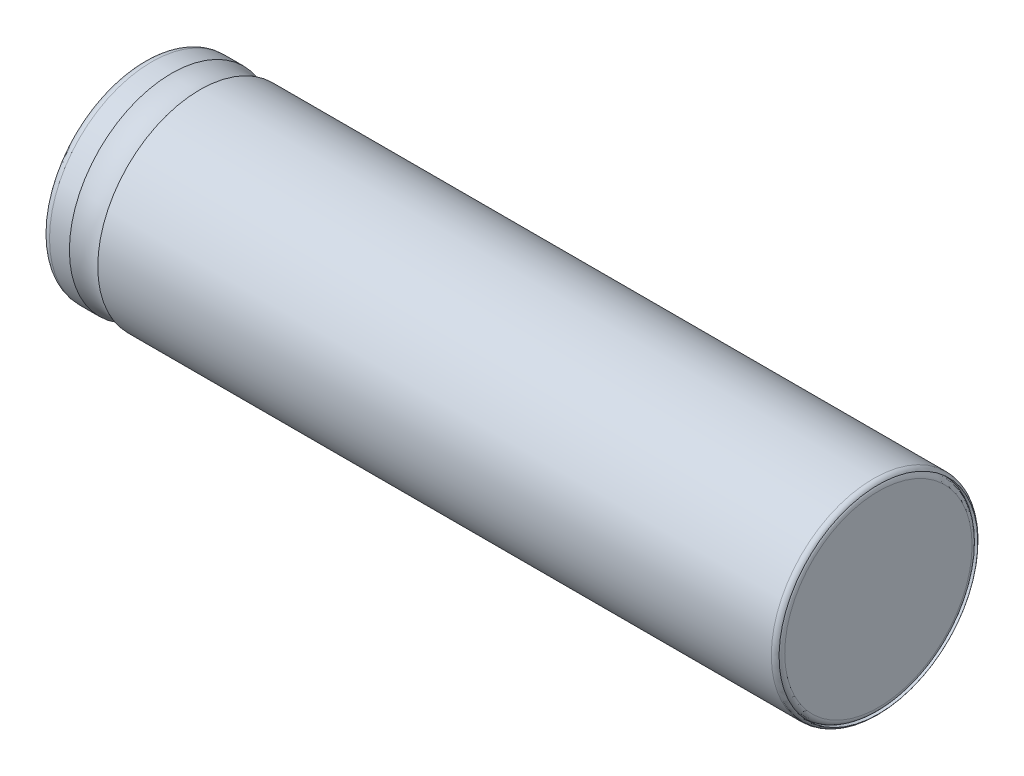
ISO-10303-21;
HEADER;
FILE_DESCRIPTION(('STEP AP214'),'2;1');
FILE_NAME('part.step','',(''),(''),'','','');
FILE_SCHEMA(('AUTOMOTIVE_DESIGN { 1 0 10303 214 1 1 1 1 }'));
ENDSEC;
DATA;
#1=APPLICATION_CONTEXT('core data for automotive mechanical design processes');
#2=APPLICATION_PROTOCOL_DEFINITION('international standard','automotive_design',2000,#1);
#3=PRODUCT_CONTEXT('',#1,'mechanical');
#4=PRODUCT('Part','Part','',(#3));
#5=PRODUCT_RELATED_PRODUCT_CATEGORY('part','',(#4));
#6=PRODUCT_DEFINITION_FORMATION('','',#4);
#7=PRODUCT_DEFINITION_CONTEXT('part definition',#1,'design');
#8=PRODUCT_DEFINITION('design','',#6,#7);
#9=PRODUCT_DEFINITION_SHAPE('','',#8);
#10=(LENGTH_UNIT() NAMED_UNIT(*) SI_UNIT(.MILLI.,.METRE.));
#11=(NAMED_UNIT(*) PLANE_ANGLE_UNIT() SI_UNIT($,.RADIAN.));
#12=(NAMED_UNIT(*) SI_UNIT($,.STERADIAN.) SOLID_ANGLE_UNIT());
#13=UNCERTAINTY_MEASURE_WITH_UNIT(LENGTH_MEASURE(1.E-05),#10,'distance_accuracy_value','');
#14=(GEOMETRIC_REPRESENTATION_CONTEXT(3) GLOBAL_UNCERTAINTY_ASSIGNED_CONTEXT((#13)) GLOBAL_UNIT_ASSIGNED_CONTEXT((#10,
#11,#12)) REPRESENTATION_CONTEXT('',''));
#15=CARTESIAN_POINT('',(0.,0.,0.));
#16=DIRECTION('',(0.,0.,1.));
#17=DIRECTION('',(1.,0.,0.));
#18=AXIS2_PLACEMENT_3D('',#15,#16,#17);
#19=CARTESIAN_POINT('',(2.099387525494,0.,0.));
#20=DIRECTION('',(1.,0.,0.));
#21=DIRECTION('',(0.,1.,0.));
#22=AXIS2_PLACEMENT_3D('',#19,#20,#21);
#23=CYLINDRICAL_SURFACE('',#22,8.75);
#24=CARTESIAN_POINT('',(3.,0.,0.));
#25=DIRECTION('',(1.,0.,0.));
#26=DIRECTION('',(0.,0.,-1.));
#27=AXIS2_PLACEMENT_3D('',#24,#25,#26);
#28=CIRCLE('',#27,8.75);
#29=CARTESIAN_POINT('',(3.,-8.75,0.));
#30=VERTEX_POINT('',#29);
#31=CARTESIAN_POINT('',(3.,0.,8.75));
#32=VERTEX_POINT('',#31);
#33=EDGE_CURVE('P0_E97',#30,#32,#28,.T.);
#34=ORIENTED_EDGE('',*,*,#33,.F.);
#35=DIRECTION('',(-1.,0.,0.));
#36=VECTOR('',#35,1.);
#37=CARTESIAN_POINT('',(2.099387525494,-8.75,0.));
#38=LINE('',#37,#36);
#39=CARTESIAN_POINT('',(1.19877505098799,-8.75,0.));
#40=VERTEX_POINT('',#39);
#41=EDGE_CURVE('P0_E11',#30,#40,#38,.T.);
#42=ORIENTED_EDGE('',*,*,#41,.T.);
#43=CARTESIAN_POINT('',(1.19877505098799,0.,0.));
#44=DIRECTION('',(1.,0.,0.));
#45=DIRECTION('',(0.,0.,-1.));
#46=AXIS2_PLACEMENT_3D('',#43,#44,#45);
#47=CIRCLE('',#46,8.75);
#48=EDGE_CURVE('P0_E27',#40,#40,#47,.T.);
#49=ORIENTED_EDGE('',*,*,#48,.T.);
#50=ORIENTED_EDGE('',*,*,#41,.F.);
#51=CARTESIAN_POINT('',(3.,0.,0.));
#52=DIRECTION('',(1.,0.,0.));
#53=DIRECTION('',(0.,0.,-1.));
#54=AXIS2_PLACEMENT_3D('',#51,#52,#53);
#55=CIRCLE('',#54,8.75);
#56=EDGE_CURVE('P0_E45',#32,#30,#55,.T.);
#57=ORIENTED_EDGE('',*,*,#56,.F.);
#58=EDGE_LOOP('',(#34,#42,#49,#50,#57));
#59=FACE_BOUND('',#58,.T.);
#60=ADVANCED_FACE('P0_F17',(#59),#23,.T.);
#61=CARTESIAN_POINT('',(1.19877505098799,8.75,0.));
#62=DIRECTION('',(-1.,0.,0.));
#63=DIRECTION('',(0.,0.,1.));
#64=AXIS2_PLACEMENT_3D('',#61,#62,#63);
#65=PLANE('',#64);
#66=ORIENTED_EDGE('',*,*,#48,.F.);
#67=EDGE_LOOP('',(#66));
#68=FACE_BOUND('',#67,.T.);
#69=ADVANCED_FACE('P0_F19',(#68),#65,.T.);
#70=CARTESIAN_POINT('',(4.25,0.,0.));
#71=DIRECTION('',(1.,0.,0.));
#72=DIRECTION('',(0.,0.,-1.));
#73=AXIS2_PLACEMENT_3D('',#70,#71,#72);
#74=TOROIDAL_SURFACE('',#73,11.7499999999994,3.24999999999946);
#75=ORIENTED_EDGE('',*,*,#33,.T.);
#76=CARTESIAN_POINT('',(4.25,0.,11.7499999999994));
#77=DIRECTION('',(0.,-1.,0.));
#78=DIRECTION('',(0.,0.,1.));
#79=AXIS2_PLACEMENT_3D('',#76,#77,#78);
#80=CIRCLE('',#79,3.24999999999946);
#81=CARTESIAN_POINT('',(5.5,0.,8.75));
#82=VERTEX_POINT('',#81);
#83=EDGE_CURVE('P0_E106',#32,#82,#80,.T.);
#84=ORIENTED_EDGE('',*,*,#83,.T.);
#85=CARTESIAN_POINT('',(5.5,0.,0.));
#86=DIRECTION('',(1.,0.,0.));
#87=DIRECTION('',(0.,0.,-1.));
#88=AXIS2_PLACEMENT_3D('',#85,#86,#87);
#89=CIRCLE('',#88,8.75);
#90=CARTESIAN_POINT('',(5.5,-8.75,0.));
#91=VERTEX_POINT('',#90);
#92=EDGE_CURVE('P0_E92',#91,#82,#89,.T.);
#93=ORIENTED_EDGE('',*,*,#92,.F.);
#94=CARTESIAN_POINT('',(5.5,0.,0.));
#95=DIRECTION('',(1.,0.,0.));
#96=DIRECTION('',(0.,0.,-1.));
#97=AXIS2_PLACEMENT_3D('',#94,#95,#96);
#98=CIRCLE('',#97,8.75);
#99=EDGE_CURVE('P0_E96',#82,#91,#98,.T.);
#100=ORIENTED_EDGE('',*,*,#99,.F.);
#101=ORIENTED_EDGE('',*,*,#83,.F.);
#102=ORIENTED_EDGE('',*,*,#56,.T.);
#103=EDGE_LOOP('',(#75,#84,#93,#100,#101,#102));
#104=FACE_BOUND('',#103,.T.);
#105=ADVANCED_FACE('P0_F111',(#104),#74,.F.);
#106=CARTESIAN_POINT('',(65.25,0.,0.));
#107=DIRECTION('',(1.,0.,0.));
#108=DIRECTION('',(0.,1.,0.));
#109=AXIS2_PLACEMENT_3D('',#106,#107,#108);
#110=PLANE('',#109);
#111=CARTESIAN_POINT('',(65.25,0.,0.));
#112=DIRECTION('',(-1.,0.,0.));
#113=DIRECTION('',(0.,-1.,0.));
#114=AXIS2_PLACEMENT_3D('',#111,#112,#113);
#115=CIRCLE('',#114,8.25);
#116=CARTESIAN_POINT('',(65.25,0.,8.25));
#117=VERTEX_POINT('',#116);
#118=EDGE_CURVE('P0_E73',#117,#117,#115,.T.);
#119=ORIENTED_EDGE('',*,*,#118,.F.);
#120=EDGE_LOOP('',(#119));
#121=FACE_BOUND('',#120,.T.);
#122=ADVANCED_FACE('P0_F126',(#121),#110,.T.);
#123=CARTESIAN_POINT('',(35.375,0.,0.));
#124=DIRECTION('',(1.,0.,0.));
#125=DIRECTION('',(0.,1.,0.));
#126=AXIS2_PLACEMENT_3D('',#123,#124,#125);
#127=CYLINDRICAL_SURFACE('',#126,8.75);
#128=CARTESIAN_POINT('',(64.75,0.,0.));
#129=DIRECTION('',(1.,0.,0.));
#130=DIRECTION('',(0.,-1.,0.));
#131=AXIS2_PLACEMENT_3D('',#128,#129,#130);
#132=CIRCLE('',#131,8.75);
#133=CARTESIAN_POINT('',(64.75,-8.75,0.));
#134=VERTEX_POINT('',#133);
#135=CARTESIAN_POINT('',(64.75,0.,8.75));
#136=VERTEX_POINT('',#135);
#137=EDGE_CURVE('P0_E76',#134,#136,#132,.T.);
#138=ORIENTED_EDGE('',*,*,#137,.F.);
#139=DIRECTION('',(-1.,0.,0.));
#140=VECTOR('',#139,1.);
#141=CARTESIAN_POINT('',(35.375,-8.75,0.));
#142=LINE('',#141,#140);
#143=EDGE_CURVE('P0_E93',#134,#91,#142,.T.);
#144=ORIENTED_EDGE('',*,*,#143,.T.);
#145=ORIENTED_EDGE('',*,*,#92,.T.);
#146=ORIENTED_EDGE('',*,*,#99,.T.);
#147=ORIENTED_EDGE('',*,*,#143,.F.);
#148=CARTESIAN_POINT('',(64.75,0.,0.));
#149=DIRECTION('',(1.,0.,0.));
#150=DIRECTION('',(0.,-1.,0.));
#151=AXIS2_PLACEMENT_3D('',#148,#149,#150);
#152=CIRCLE('',#151,8.75);
#153=EDGE_CURVE('P0_E78',#136,#134,#152,.T.);
#154=ORIENTED_EDGE('',*,*,#153,.F.);
#155=EDGE_LOOP('',(#138,#144,#145,#146,#147,#154));
#156=FACE_BOUND('',#155,.T.);
#157=ADVANCED_FACE('P0_F130',(#156),#127,.T.);
#158=CARTESIAN_POINT('',(64.75,0.,0.));
#159=DIRECTION('',(1.,0.,0.));
#160=DIRECTION('',(0.,0.,-1.));
#161=AXIS2_PLACEMENT_3D('',#158,#159,#160);
#162=TOROIDAL_SURFACE('',#161,8.25,0.5);
#163=ORIENTED_EDGE('',*,*,#118,.T.);
#164=CARTESIAN_POINT('',(64.75,0.,8.25));
#165=DIRECTION('',(0.,-1.,0.));
#166=DIRECTION('',(0.,0.,1.));
#167=AXIS2_PLACEMENT_3D('',#164,#165,#166);
#168=CIRCLE('',#167,0.5);
#169=EDGE_CURVE('P0_E69',#117,#136,#168,.T.);
#170=ORIENTED_EDGE('',*,*,#169,.T.);
#171=ORIENTED_EDGE('',*,*,#153,.T.);
#172=ORIENTED_EDGE('',*,*,#137,.T.);
#173=ORIENTED_EDGE('',*,*,#169,.F.);
#174=EDGE_LOOP('',(#163,#170,#171,#172,#173));
#175=FACE_BOUND('',#174,.T.);
#176=ADVANCED_FACE('P0_F75',(#175),#162,.T.);
#177=CLOSED_SHELL('',(#60,#69,#105,#122,#157,#176));
#178=MANIFOLD_SOLID_BREP('P0_B1',#177);
#179=CARTESIAN_POINT('',(1.19877505098799,0.,0.));
#180=DIRECTION('',(1.,0.,0.));
#181=DIRECTION('',(0.,-1.,0.));
#182=AXIS2_PLACEMENT_3D('',#179,#180,#181);
#183=PLANE('',#182);
#184=CARTESIAN_POINT('',(1.19877505098799,0.,0.));
#185=DIRECTION('',(1.,0.,0.));
#186=DIRECTION('',(0.,0.,-1.));
#187=AXIS2_PLACEMENT_3D('',#184,#185,#186);
#188=CIRCLE('',#187,4.);
#189=CARTESIAN_POINT('',(1.19877505098799,-4.,0.));
#190=VERTEX_POINT('',#189);
#191=EDGE_CURVE('P1_E25',#190,#190,#188,.T.);
#192=ORIENTED_EDGE('',*,*,#191,.T.);
#193=EDGE_LOOP('',(#192));
#194=FACE_BOUND('',#193,.T.);
#195=ADVANCED_FACE('P1_F17',(#194),#183,.T.);
#196=CARTESIAN_POINT('',(0.599387525493993,0.,0.));
#197=DIRECTION('',(1.,0.,0.));
#198=DIRECTION('',(0.,1.,0.));
#199=AXIS2_PLACEMENT_3D('',#196,#197,#198);
#200=CYLINDRICAL_SURFACE('',#199,4.);
#201=ORIENTED_EDGE('',*,*,#191,.F.);
#202=DIRECTION('',(-1.,0.,0.));
#203=VECTOR('',#202,1.);
#204=CARTESIAN_POINT('',(0.599387525493989,-4.,0.));
#205=LINE('',#204,#203);
#206=CARTESIAN_POINT('',(0.499999999999991,-4.,0.));
#207=VERTEX_POINT('',#206);
#208=EDGE_CURVE('P1_E11',#190,#207,#205,.T.);
#209=ORIENTED_EDGE('',*,*,#208,.T.);
#210=CARTESIAN_POINT('',(0.5,0.,0.));
#211=DIRECTION('',(-1.,0.,0.));
#212=DIRECTION('',(0.,-1.,0.));
#213=AXIS2_PLACEMENT_3D('',#210,#211,#212);
#214=CIRCLE('',#213,4.);
#215=CARTESIAN_POINT('',(0.5,0.,4.));
#216=VERTEX_POINT('',#215);
#217=EDGE_CURVE('P1_E60',#216,#207,#214,.T.);
#218=ORIENTED_EDGE('',*,*,#217,.F.);
#219=CARTESIAN_POINT('',(0.5,0.,0.));
#220=DIRECTION('',(-1.,0.,0.));
#221=DIRECTION('',(0.,-1.,0.));
#222=AXIS2_PLACEMENT_3D('',#219,#220,#221);
#223=CIRCLE('',#222,4.);
#224=EDGE_CURVE('P1_E56',#207,#216,#223,.T.);
#225=ORIENTED_EDGE('',*,*,#224,.F.);
#226=ORIENTED_EDGE('',*,*,#208,.F.);
#227=EDGE_LOOP('',(#201,#209,#218,#225,#226));
#228=FACE_BOUND('',#227,.T.);
#229=ADVANCED_FACE('P1_F64',(#228),#200,.T.);
#230=CARTESIAN_POINT('',(0.,4.,0.));
#231=DIRECTION('',(-1.,0.,0.));
#232=DIRECTION('',(0.,0.,1.));
#233=AXIS2_PLACEMENT_3D('',#230,#231,#232);
#234=PLANE('',#233);
#235=CARTESIAN_POINT('',(0.,0.,0.));
#236=DIRECTION('',(1.,0.,0.));
#237=DIRECTION('',(0.,-1.,0.));
#238=AXIS2_PLACEMENT_3D('',#235,#236,#237);
#239=CIRCLE('',#238,3.5);
#240=CARTESIAN_POINT('',(0.,0.,3.5));
#241=VERTEX_POINT('',#240);
#242=EDGE_CURVE('P1_E44',#241,#241,#239,.T.);
#243=ORIENTED_EDGE('',*,*,#242,.F.);
#244=EDGE_LOOP('',(#243));
#245=FACE_BOUND('',#244,.T.);
#246=ADVANCED_FACE('P1_F79',(#245),#234,.T.);
#247=CARTESIAN_POINT('',(0.5,0.,0.));
#248=DIRECTION('',(1.,0.,0.));
#249=DIRECTION('',(0.,0.,-1.));
#250=AXIS2_PLACEMENT_3D('',#247,#248,#249);
#251=TOROIDAL_SURFACE('',#250,3.5,0.5);
#252=ORIENTED_EDGE('',*,*,#217,.T.);
#253=ORIENTED_EDGE('',*,*,#224,.T.);
#254=CARTESIAN_POINT('',(0.5,0.,3.5));
#255=DIRECTION('',(0.,-1.,0.));
#256=DIRECTION('',(0.,0.,1.));
#257=AXIS2_PLACEMENT_3D('',#254,#255,#256);
#258=CIRCLE('',#257,0.5);
#259=EDGE_CURVE('P1_E52',#216,#241,#258,.T.);
#260=ORIENTED_EDGE('',*,*,#259,.T.);
#261=ORIENTED_EDGE('',*,*,#242,.T.);
#262=ORIENTED_EDGE('',*,*,#259,.F.);
#263=EDGE_LOOP('',(#252,#253,#260,#261,#262));
#264=FACE_BOUND('',#263,.T.);
#265=ADVANCED_FACE('P1_F54',(#264),#251,.T.);
#266=CLOSED_SHELL('',(#195,#229,#246,#265));
#267=MANIFOLD_SOLID_BREP('P1_B1',#266);
#268=CARTESIAN_POINT('',(0.75,8.75,0.));
#269=DIRECTION('',(-1.,0.,0.));
#270=DIRECTION('',(0.,1.,0.));
#271=AXIS2_PLACEMENT_3D('',#268,#269,#270);
#272=PLANE('',#271);
#273=CARTESIAN_POINT('',(0.75,0.,0.));
#274=DIRECTION('',(1.,0.,0.));
#275=DIRECTION('',(0.,0.,-1.));
#276=AXIS2_PLACEMENT_3D('',#273,#274,#275);
#277=CIRCLE('',#276,4.);
#278=CARTESIAN_POINT('',(0.75,-4.,0.));
#279=VERTEX_POINT('',#278);
#280=EDGE_CURVE('P2_E11',#279,#279,#277,.T.);
#281=ORIENTED_EDGE('',*,*,#280,.T.);
#282=EDGE_LOOP('',(#281));
#283=FACE_BOUND('',#282,.T.);
#284=CARTESIAN_POINT('',(0.75,0.,0.));
#285=DIRECTION('',(1.,0.,0.));
#286=DIRECTION('',(0.,0.,-1.));
#287=AXIS2_PLACEMENT_3D('',#284,#285,#286);
#288=CIRCLE('',#287,8.75);
#289=CARTESIAN_POINT('',(0.75,-8.75,0.));
#290=VERTEX_POINT('',#289);
#291=EDGE_CURVE('P2_E59',#290,#290,#288,.T.);
#292=ORIENTED_EDGE('',*,*,#291,.F.);
#293=EDGE_LOOP('',(#292));
#294=FACE_BOUND('',#293,.T.);
#295=ADVANCED_FACE('P2_F17',(#283,#294),#272,.T.);
#296=CARTESIAN_POINT('',(0.974387525493999,0.,0.));
#297=DIRECTION('',(1.,0.,0.));
#298=DIRECTION('',(0.,1.,0.));
#299=AXIS2_PLACEMENT_3D('',#296,#297,#298);
#300=CYLINDRICAL_SURFACE('',#299,4.);
#301=CARTESIAN_POINT('',(1.198775050988,0.,0.));
#302=DIRECTION('',(1.,0.,0.));
#303=DIRECTION('',(0.,0.,-1.));
#304=AXIS2_PLACEMENT_3D('',#301,#302,#303);
#305=CIRCLE('',#304,4.);
#306=CARTESIAN_POINT('',(1.198775050988,-4.,0.));
#307=VERTEX_POINT('',#306);
#308=EDGE_CURVE('P2_E69',#307,#307,#305,.T.);
#309=ORIENTED_EDGE('',*,*,#308,.T.);
#310=DIRECTION('',(-1.,0.,0.));
#311=VECTOR('',#310,1.);
#312=CARTESIAN_POINT('',(0.974387525494001,-4.,0.));
#313=LINE('',#312,#311);
#314=EDGE_CURVE('P2_E20',#307,#279,#313,.T.);
#315=ORIENTED_EDGE('',*,*,#314,.T.);
#316=ORIENTED_EDGE('',*,*,#280,.F.);
#317=ORIENTED_EDGE('',*,*,#314,.F.);
#318=EDGE_LOOP('',(#309,#315,#316,#317));
#319=FACE_BOUND('',#318,.T.);
#320=ADVANCED_FACE('P2_F77',(#319),#300,.F.);
#321=CARTESIAN_POINT('',(1.19877505098799,4.,0.));
#322=DIRECTION('',(1.,0.,0.));
#323=DIRECTION('',(0.,1.,0.));
#324=AXIS2_PLACEMENT_3D('',#321,#322,#323);
#325=PLANE('',#324);
#326=ORIENTED_EDGE('',*,*,#308,.F.);
#327=EDGE_LOOP('',(#326));
#328=FACE_BOUND('',#327,.T.);
#329=CARTESIAN_POINT('',(1.198775050988,0.,0.));
#330=DIRECTION('',(1.,0.,0.));
#331=DIRECTION('',(0.,0.,-1.));
#332=AXIS2_PLACEMENT_3D('',#329,#330,#331);
#333=CIRCLE('',#332,8.75);
#334=CARTESIAN_POINT('',(1.198775050988,-8.75,0.));
#335=VERTEX_POINT('',#334);
#336=EDGE_CURVE('P2_E57',#335,#335,#333,.T.);
#337=ORIENTED_EDGE('',*,*,#336,.T.);
#338=EDGE_LOOP('',(#337));
#339=FACE_BOUND('',#338,.T.);
#340=ADVANCED_FACE('P2_F62',(#328,#339),#325,.T.);
#341=CARTESIAN_POINT('',(0.974387525494002,0.,0.));
#342=DIRECTION('',(1.,0.,0.));
#343=DIRECTION('',(0.,1.,0.));
#344=AXIS2_PLACEMENT_3D('',#341,#342,#343);
#345=CYLINDRICAL_SURFACE('',#344,8.75);
#346=ORIENTED_EDGE('',*,*,#336,.F.);
#347=DIRECTION('',(-1.,0.,0.));
#348=VECTOR('',#347,1.);
#349=CARTESIAN_POINT('',(0.974387525494006,-8.75,0.));
#350=LINE('',#349,#348);
#351=EDGE_CURVE('P2_E52',#335,#290,#350,.T.);
#352=ORIENTED_EDGE('',*,*,#351,.T.);
#353=ORIENTED_EDGE('',*,*,#291,.T.);
#354=ORIENTED_EDGE('',*,*,#351,.F.);
#355=EDGE_LOOP('',(#346,#352,#353,#354));
#356=FACE_BOUND('',#355,.T.);
#357=ADVANCED_FACE('P2_F54',(#356),#345,.T.);
#358=CLOSED_SHELL('',(#295,#320,#340,#357));
#359=MANIFOLD_SOLID_BREP('P2_B1',#358);
#360=CARTESIAN_POINT('',(0.75,7.,0.));
#361=DIRECTION('',(1.,0.,0.));
#362=DIRECTION('',(0.,1.,0.));
#363=AXIS2_PLACEMENT_3D('',#360,#361,#362);
#364=PLANE('',#363);
#365=CARTESIAN_POINT('',(0.75,0.,0.));
#366=DIRECTION('',(1.,0.,0.));
#367=DIRECTION('',(0.,0.,-1.));
#368=AXIS2_PLACEMENT_3D('',#365,#366,#367);
#369=CIRCLE('',#368,7.);
#370=CARTESIAN_POINT('',(0.75,-7.,0.));
#371=VERTEX_POINT('',#370);
#372=EDGE_CURVE('P3_E138',#371,#371,#369,.T.);
#373=ORIENTED_EDGE('',*,*,#372,.F.);
#374=EDGE_LOOP('',(#373));
#375=FACE_BOUND('',#374,.T.);
#376=CARTESIAN_POINT('',(0.75,0.,0.));
#377=DIRECTION('',(1.,0.,0.));
#378=DIRECTION('',(0.,0.,-1.));
#379=AXIS2_PLACEMENT_3D('',#376,#377,#378);
#380=CIRCLE('',#379,8.75);
#381=CARTESIAN_POINT('',(0.75,-8.75,0.));
#382=VERTEX_POINT('',#381);
#383=EDGE_CURVE('P3_E10',#382,#382,#380,.T.);
#384=ORIENTED_EDGE('',*,*,#383,.T.);
#385=EDGE_LOOP('',(#384));
#386=FACE_BOUND('',#385,.T.);
#387=ADVANCED_FACE('P3_F16',(#375,#386),#364,.T.);
#388=CARTESIAN_POINT('',(1.875,0.,0.));
#389=DIRECTION('',(1.,0.,0.));
#390=DIRECTION('',(0.,1.,0.));
#391=AXIS2_PLACEMENT_3D('',#388,#389,#390);
#392=CYLINDRICAL_SURFACE('',#391,8.75);
#393=CARTESIAN_POINT('',(3.,0.,0.));
#394=DIRECTION('',(1.,0.,0.));
#395=DIRECTION('',(0.,0.,-1.));
#396=AXIS2_PLACEMENT_3D('',#393,#394,#395);
#397=CIRCLE('',#396,8.75);
#398=CARTESIAN_POINT('',(3.,-8.75,0.));
#399=VERTEX_POINT('',#398);
#400=CARTESIAN_POINT('',(3.,0.,8.75));
#401=VERTEX_POINT('',#400);
#402=EDGE_CURVE('P3_E177',#399,#401,#397,.T.);
#403=ORIENTED_EDGE('',*,*,#402,.T.);
#404=CARTESIAN_POINT('',(3.,0.,0.));
#405=DIRECTION('',(1.,0.,0.));
#406=DIRECTION('',(0.,0.,-1.));
#407=AXIS2_PLACEMENT_3D('',#404,#405,#406);
#408=CIRCLE('',#407,8.75);
#409=EDGE_CURVE('P3_E181',#401,#399,#408,.T.);
#410=ORIENTED_EDGE('',*,*,#409,.T.);
#411=DIRECTION('',(-1.,0.,0.));
#412=VECTOR('',#411,1.);
#413=CARTESIAN_POINT('',(1.875,-8.75,0.));
#414=LINE('',#413,#412);
#415=EDGE_CURVE('P3_E27',#399,#382,#414,.T.);
#416=ORIENTED_EDGE('',*,*,#415,.T.);
#417=ORIENTED_EDGE('',*,*,#383,.F.);
#418=ORIENTED_EDGE('',*,*,#415,.F.);
#419=EDGE_LOOP('',(#403,#410,#416,#417,#418));
#420=FACE_BOUND('',#419,.T.);
#421=ADVANCED_FACE('P3_F191',(#420),#392,.F.);
#422=CARTESIAN_POINT('',(4.25,0.,0.));
#423=DIRECTION('',(1.,0.,0.));
#424=DIRECTION('',(0.,0.,-1.));
#425=AXIS2_PLACEMENT_3D('',#422,#423,#424);
#426=TOROIDAL_SURFACE('',#425,11.7499999999994,3.24999999999946);
#427=ORIENTED_EDGE('',*,*,#402,.F.);
#428=ORIENTED_EDGE('',*,*,#409,.F.);
#429=CARTESIAN_POINT('',(4.25,0.,11.7499999999994));
#430=DIRECTION('',(0.,-1.,0.));
#431=DIRECTION('',(0.,0.,1.));
#432=AXIS2_PLACEMENT_3D('',#429,#430,#431);
#433=CIRCLE('',#432,3.24999999999946);
#434=CARTESIAN_POINT('',(5.5,0.,8.75));
#435=VERTEX_POINT('',#434);
#436=EDGE_CURVE('P3_E186',#401,#435,#433,.T.);
#437=ORIENTED_EDGE('',*,*,#436,.T.);
#438=CARTESIAN_POINT('',(5.5,0.,0.));
#439=DIRECTION('',(1.,0.,0.));
#440=DIRECTION('',(0.,0.,-1.));
#441=AXIS2_PLACEMENT_3D('',#438,#439,#440);
#442=CIRCLE('',#441,8.75);
#443=CARTESIAN_POINT('',(5.5,-8.75,0.));
#444=VERTEX_POINT('',#443);
#445=EDGE_CURVE('P3_E168',#435,#444,#442,.T.);
#446=ORIENTED_EDGE('',*,*,#445,.T.);
#447=CARTESIAN_POINT('',(5.5,0.,0.));
#448=DIRECTION('',(1.,0.,0.));
#449=DIRECTION('',(0.,0.,-1.));
#450=AXIS2_PLACEMENT_3D('',#447,#448,#449);
#451=CIRCLE('',#450,8.75);
#452=EDGE_CURVE('P3_E173',#444,#435,#451,.T.);
#453=ORIENTED_EDGE('',*,*,#452,.T.);
#454=ORIENTED_EDGE('',*,*,#436,.F.);
#455=EDGE_LOOP('',(#427,#428,#437,#446,#453,#454));
#456=FACE_BOUND('',#455,.T.);
#457=ADVANCED_FACE('P3_F18',(#456),#426,.T.);
#458=CARTESIAN_POINT('',(35.375,0.,0.));
#459=DIRECTION('',(1.,0.,0.));
#460=DIRECTION('',(0.,1.,0.));
#461=AXIS2_PLACEMENT_3D('',#458,#459,#460);
#462=CYLINDRICAL_SURFACE('',#461,8.75);
#463=CARTESIAN_POINT('',(65.25,0.,0.));
#464=DIRECTION('',(1.,0.,0.));
#465=DIRECTION('',(0.,0.,-1.));
#466=AXIS2_PLACEMENT_3D('',#463,#464,#465);
#467=CIRCLE('',#466,8.75);
#468=CARTESIAN_POINT('',(65.25,-8.75,0.));
#469=VERTEX_POINT('',#468);
#470=EDGE_CURVE('P3_E104',#469,#469,#467,.T.);
#471=ORIENTED_EDGE('',*,*,#470,.T.);
#472=DIRECTION('',(-1.,0.,0.));
#473=VECTOR('',#472,1.);
#474=CARTESIAN_POINT('',(35.375,-8.75,0.));
#475=LINE('',#474,#473);
#476=EDGE_CURVE('P3_E167',#469,#444,#475,.T.);
#477=ORIENTED_EDGE('',*,*,#476,.T.);
#478=ORIENTED_EDGE('',*,*,#445,.F.);
#479=ORIENTED_EDGE('',*,*,#452,.F.);
#480=ORIENTED_EDGE('',*,*,#476,.F.);
#481=EDGE_LOOP('',(#471,#477,#478,#479,#480));
#482=FACE_BOUND('',#481,.T.);
#483=ADVANCED_FACE('P3_F258',(#482),#462,.F.);
#484=CARTESIAN_POINT('',(4.25,0.,0.));
#485=DIRECTION('',(1.,0.,0.));
#486=DIRECTION('',(0.,0.,-1.));
#487=AXIS2_PLACEMENT_3D('',#484,#485,#486);
#488=TOROIDAL_SURFACE('',#487,12.,3.25);
#489=CARTESIAN_POINT('',(3.,0.,0.));
#490=DIRECTION('',(1.,0.,0.));
#491=DIRECTION('',(0.,0.,-1.));
#492=AXIS2_PLACEMENT_3D('',#489,#490,#491);
#493=CIRCLE('',#492,9.);
#494=CARTESIAN_POINT('',(3.,-9.,0.));
#495=VERTEX_POINT('',#494);
#496=CARTESIAN_POINT('',(3.,0.,9.));
#497=VERTEX_POINT('',#496);
#498=EDGE_CURVE('P3_E155',#495,#497,#493,.T.);
#499=ORIENTED_EDGE('',*,*,#498,.T.);
#500=CARTESIAN_POINT('',(4.25,0.,12.));
#501=DIRECTION('',(0.,-1.,0.));
#502=DIRECTION('',(0.,0.,1.));
#503=AXIS2_PLACEMENT_3D('',#500,#501,#502);
#504=CIRCLE('',#503,3.25);
#505=CARTESIAN_POINT('',(5.5,0.,9.));
#506=VERTEX_POINT('',#505);
#507=EDGE_CURVE('P3_E154',#497,#506,#504,.T.);
#508=ORIENTED_EDGE('',*,*,#507,.T.);
#509=CARTESIAN_POINT('',(5.5,0.,0.));
#510=DIRECTION('',(1.,0.,0.));
#511=DIRECTION('',(0.,0.,-1.));
#512=AXIS2_PLACEMENT_3D('',#509,#510,#511);
#513=CIRCLE('',#512,9.);
#514=CARTESIAN_POINT('',(5.5,-9.,0.));
#515=VERTEX_POINT('',#514);
#516=EDGE_CURVE('P3_E102',#515,#506,#513,.T.);
#517=ORIENTED_EDGE('',*,*,#516,.F.);
#518=CARTESIAN_POINT('',(5.5,0.,0.));
#519=DIRECTION('',(1.,0.,0.));
#520=DIRECTION('',(0.,0.,-1.));
#521=AXIS2_PLACEMENT_3D('',#518,#519,#520);
#522=CIRCLE('',#521,9.);
#523=EDGE_CURVE('P3_E101',#506,#515,#522,.T.);
#524=ORIENTED_EDGE('',*,*,#523,.F.);
#525=ORIENTED_EDGE('',*,*,#507,.F.);
#526=CARTESIAN_POINT('',(3.,0.,0.));
#527=DIRECTION('',(1.,0.,0.));
#528=DIRECTION('',(0.,0.,-1.));
#529=AXIS2_PLACEMENT_3D('',#526,#527,#528);
#530=CIRCLE('',#529,9.);
#531=EDGE_CURVE('P3_E144',#497,#495,#530,.T.);
#532=ORIENTED_EDGE('',*,*,#531,.T.);
#533=EDGE_LOOP('',(#499,#508,#517,#524,#525,#532));
#534=FACE_BOUND('',#533,.T.);
#535=ADVANCED_FACE('P3_F256',(#534),#488,.F.);
#536=CARTESIAN_POINT('',(0.625,0.,0.));
#537=DIRECTION('',(1.,0.,0.));
#538=DIRECTION('',(0.,1.,0.));
#539=AXIS2_PLACEMENT_3D('',#536,#537,#538);
#540=CYLINDRICAL_SURFACE('',#539,7.);
#541=ORIENTED_EDGE('',*,*,#372,.T.);
#542=DIRECTION('',(-1.,0.,0.));
#543=VECTOR('',#542,1.);
#544=CARTESIAN_POINT('',(0.625,-7.,0.));
#545=LINE('',#544,#543);
#546=CARTESIAN_POINT('',(0.5,-7.,0.));
#547=VERTEX_POINT('',#546);
#548=EDGE_CURVE('P3_E145',#371,#547,#545,.T.);
#549=ORIENTED_EDGE('',*,*,#548,.T.);
#550=CARTESIAN_POINT('',(0.5,0.,0.));
#551=DIRECTION('',(1.,0.,0.));
#552=DIRECTION('',(0.,0.,-1.));
#553=AXIS2_PLACEMENT_3D('',#550,#551,#552);
#554=CIRCLE('',#553,7.);
#555=EDGE_CURVE('P3_E146',#547,#547,#554,.T.);
#556=ORIENTED_EDGE('',*,*,#555,.F.);
#557=ORIENTED_EDGE('',*,*,#548,.F.);
#558=EDGE_LOOP('',(#541,#549,#556,#557));
#559=FACE_BOUND('',#558,.T.);
#560=ADVANCED_FACE('P3_F264',(#559),#540,.F.);
#561=CARTESIAN_POINT('',(1.75,0.,0.));
#562=DIRECTION('',(1.,0.,0.));
#563=DIRECTION('',(0.,1.,0.));
#564=AXIS2_PLACEMENT_3D('',#561,#562,#563);
#565=CYLINDRICAL_SURFACE('',#564,9.);
#566=ORIENTED_EDGE('',*,*,#498,.F.);
#567=DIRECTION('',(-1.,0.,0.));
#568=VECTOR('',#567,1.);
#569=CARTESIAN_POINT('',(1.75,-9.,0.));
#570=LINE('',#569,#568);
#571=CARTESIAN_POINT('',(1.25,-9.,0.));
#572=VERTEX_POINT('',#571);
#573=EDGE_CURVE('P3_E157',#495,#572,#570,.T.);
#574=ORIENTED_EDGE('',*,*,#573,.T.);
#575=CARTESIAN_POINT('',(1.25,0.,0.));
#576=DIRECTION('',(-1.,0.,0.));
#577=DIRECTION('',(0.,-1.,0.));
#578=AXIS2_PLACEMENT_3D('',#575,#576,#577);
#579=CIRCLE('',#578,9.);
#580=CARTESIAN_POINT('',(1.25,0.,9.));
#581=VERTEX_POINT('',#580);
#582=EDGE_CURVE('P3_E126',#581,#572,#579,.T.);
#583=ORIENTED_EDGE('',*,*,#582,.F.);
#584=CARTESIAN_POINT('',(1.25,0.,0.));
#585=DIRECTION('',(-1.,0.,0.));
#586=DIRECTION('',(0.,-1.,0.));
#587=AXIS2_PLACEMENT_3D('',#584,#585,#586);
#588=CIRCLE('',#587,9.);
#589=EDGE_CURVE('P3_E131',#572,#581,#588,.T.);
#590=ORIENTED_EDGE('',*,*,#589,.F.);
#591=ORIENTED_EDGE('',*,*,#573,.F.);
#592=ORIENTED_EDGE('',*,*,#531,.F.);
#593=EDGE_LOOP('',(#566,#574,#583,#590,#591,#592));
#594=FACE_BOUND('',#593,.T.);
#595=ADVANCED_FACE('P3_F276',(#594),#565,.T.);
#596=CARTESIAN_POINT('',(0.5,9.,0.));
#597=DIRECTION('',(-1.,0.,0.));
#598=DIRECTION('',(0.,0.,1.));
#599=AXIS2_PLACEMENT_3D('',#596,#597,#598);
#600=PLANE('',#599);
#601=ORIENTED_EDGE('',*,*,#555,.T.);
#602=EDGE_LOOP('',(#601));
#603=FACE_BOUND('',#602,.T.);
#604=CARTESIAN_POINT('',(0.5,0.,0.));
#605=DIRECTION('',(1.,0.,0.));
#606=DIRECTION('',(0.,-1.,0.));
#607=AXIS2_PLACEMENT_3D('',#604,#605,#606);
#608=CIRCLE('',#607,8.25);
#609=CARTESIAN_POINT('',(0.5,0.,8.25));
#610=VERTEX_POINT('',#609);
#611=EDGE_CURVE('P3_E136',#610,#610,#608,.T.);
#612=ORIENTED_EDGE('',*,*,#611,.F.);
#613=EDGE_LOOP('',(#612));
#614=FACE_BOUND('',#613,.T.);
#615=ADVANCED_FACE('P3_F279',(#603,#614),#600,.T.);
#616=CARTESIAN_POINT('',(1.25,0.,0.));
#617=DIRECTION('',(1.,0.,0.));
#618=DIRECTION('',(0.,0.,-1.));
#619=AXIS2_PLACEMENT_3D('',#616,#617,#618);
#620=TOROIDAL_SURFACE('',#619,8.25,0.75);
#621=ORIENTED_EDGE('',*,*,#582,.T.);
#622=ORIENTED_EDGE('',*,*,#589,.T.);
#623=CARTESIAN_POINT('',(1.25,0.,8.25));
#624=DIRECTION('',(0.,-1.,0.));
#625=DIRECTION('',(0.,0.,1.));
#626=AXIS2_PLACEMENT_3D('',#623,#624,#625);
#627=CIRCLE('',#626,0.75);
#628=EDGE_CURVE('P3_E134',#581,#610,#627,.T.);
#629=ORIENTED_EDGE('',*,*,#628,.T.);
#630=ORIENTED_EDGE('',*,*,#611,.T.);
#631=ORIENTED_EDGE('',*,*,#628,.F.);
#632=EDGE_LOOP('',(#621,#622,#629,#630,#631));
#633=FACE_BOUND('',#632,.T.);
#634=ADVANCED_FACE('P3_F295',(#633),#620,.T.);
#635=CARTESIAN_POINT('',(35.375,0.,0.));
#636=DIRECTION('',(1.,0.,0.));
#637=DIRECTION('',(0.,1.,0.));
#638=AXIS2_PLACEMENT_3D('',#635,#636,#637);
#639=CYLINDRICAL_SURFACE('',#638,9.);
#640=CARTESIAN_POINT('',(64.8169872981078,0.,0.));
#641=DIRECTION('',(1.,0.,0.));
#642=DIRECTION('',(0.,1.,0.));
#643=AXIS2_PLACEMENT_3D('',#640,#641,#642);
#644=CIRCLE('',#643,9.);
#645=CARTESIAN_POINT('',(64.8169872981078,-9.,0.));
#646=VERTEX_POINT('',#645);
#647=EDGE_CURVE('P3_E98',#646,#646,#644,.T.);
#648=ORIENTED_EDGE('',*,*,#647,.F.);
#649=DIRECTION('',(-1.,0.,0.));
#650=VECTOR('',#649,1.);
#651=CARTESIAN_POINT('',(35.375,-9.,0.));
#652=LINE('',#651,#650);
#653=EDGE_CURVE('P3_E94',#646,#515,#652,.T.);
#654=ORIENTED_EDGE('',*,*,#653,.T.);
#655=ORIENTED_EDGE('',*,*,#516,.T.);
#656=ORIENTED_EDGE('',*,*,#523,.T.);
#657=ORIENTED_EDGE('',*,*,#653,.F.);
#658=EDGE_LOOP('',(#648,#654,#655,#656,#657));
#659=FACE_BOUND('',#658,.T.);
#660=ADVANCED_FACE('P3_F96',(#659),#639,.T.);
#661=CARTESIAN_POINT('',(64.8169872981078,0.,0.));
#662=DIRECTION('',(-1.,0.,0.));
#663=DIRECTION('',(0.,1.,0.));
#664=AXIS2_PLACEMENT_3D('',#661,#662,#663);
#665=TOROIDAL_SURFACE('',#664,8.5,0.5);
#666=ORIENTED_EDGE('',*,*,#647,.T.);
#667=CARTESIAN_POINT('',(64.8169872981078,-8.5,0.));
#668=DIRECTION('',(0.,0.,1.));
#669=DIRECTION('',(0.,-1.,0.));
#670=AXIS2_PLACEMENT_3D('',#667,#668,#669);
#671=CIRCLE('',#670,0.5);
#672=EDGE_CURVE('P3_E109',#646,#469,#671,.T.);
#673=ORIENTED_EDGE('',*,*,#672,.T.);
#674=ORIENTED_EDGE('',*,*,#470,.F.);
#675=ORIENTED_EDGE('',*,*,#672,.F.);
#676=EDGE_LOOP('',(#666,#673,#674,#675));
#677=FACE_BOUND('',#676,.T.);
#678=ADVANCED_FACE('P3_F112',(#677),#665,.T.);
#679=CLOSED_SHELL('',(#387,#421,#457,#483,#535,#560,#595,#615,#634,#660,#678));
#680=MANIFOLD_SOLID_BREP('P3_B1',#679);
#681=ADVANCED_BREP_SHAPE_REPRESENTATION('',(#18,#178,#267,#359,#680),#14);
#682=SHAPE_DEFINITION_REPRESENTATION(#9,#681);
ENDSEC;
END-ISO-10303-21;
